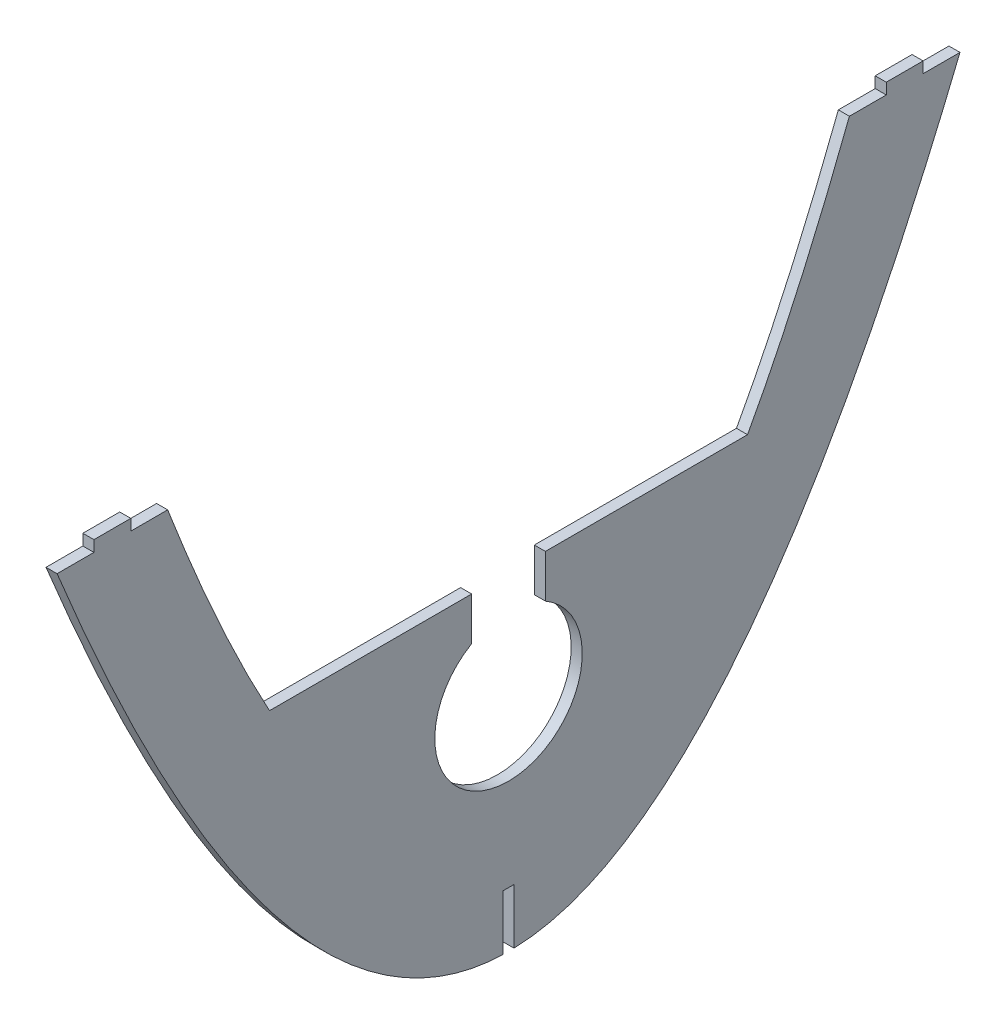
ISO-10303-21;
HEADER;
FILE_DESCRIPTION(('STEP AP214'),'2;1');
FILE_NAME('part.step','',(''),(''),'','','');
FILE_SCHEMA(('AUTOMOTIVE_DESIGN { 1 0 10303 214 1 1 1 1 }'));
ENDSEC;
DATA;
#1=APPLICATION_CONTEXT('core data for automotive mechanical design processes');
#2=APPLICATION_PROTOCOL_DEFINITION('international standard','automotive_design',2000,#1);
#3=PRODUCT_CONTEXT('',#1,'mechanical');
#4=PRODUCT('Part','Part','',(#3));
#5=PRODUCT_RELATED_PRODUCT_CATEGORY('part','',(#4));
#6=PRODUCT_DEFINITION_FORMATION('','',#4);
#7=PRODUCT_DEFINITION_CONTEXT('part definition',#1,'design');
#8=PRODUCT_DEFINITION('design','',#6,#7);
#9=PRODUCT_DEFINITION_SHAPE('','',#8);
#10=(LENGTH_UNIT() NAMED_UNIT(*) SI_UNIT(.MILLI.,.METRE.));
#11=(NAMED_UNIT(*) PLANE_ANGLE_UNIT() SI_UNIT($,.RADIAN.));
#12=(NAMED_UNIT(*) SI_UNIT($,.STERADIAN.) SOLID_ANGLE_UNIT());
#13=UNCERTAINTY_MEASURE_WITH_UNIT(LENGTH_MEASURE(1.E-05),#10,'distance_accuracy_value','');
#14=(GEOMETRIC_REPRESENTATION_CONTEXT(3) GLOBAL_UNCERTAINTY_ASSIGNED_CONTEXT((#13)) GLOBAL_UNIT_ASSIGNED_CONTEXT((#10,
#11,#12)) REPRESENTATION_CONTEXT('',''));
#15=CARTESIAN_POINT('',(0.,0.,0.));
#16=DIRECTION('',(0.,0.,1.));
#17=DIRECTION('',(1.,0.,0.));
#18=AXIS2_PLACEMENT_3D('',#15,#16,#17);
#19=CARTESIAN_POINT('',(3.,150.001256250819,122.475000000334));
#20=CARTESIAN_POINT('',(3.,-150.001256250735,3.44333936364016E-11));
#21=CARTESIAN_POINT('',(3.,150.001256250651,-122.475000000266));
#22=B_SPLINE_CURVE_WITH_KNOTS('',2,(#19,#20,#21),.UNSPECIFIED.,.F.,.F.,(3,3),
(0.0532838553968398,0.946716144602909),.UNSPECIFIED.);
#23=DIRECTION('',(-1.,0.,0.));
#24=VECTOR('',#23,1.);
#25=SURFACE_OF_LINEAR_EXTRUSION('',#22,#24);
#26=DIRECTION('',(-1.,0.,0.));
#27=VECTOR('',#26,1.);
#28=CARTESIAN_POINT('',(3.05,0.0225000000001966,1.50000000000711));
#29=LINE('',#28,#27);
#30=CARTESIAN_POINT('',(3.,0.0225000000001966,1.50000000000711));
#31=VERTEX_POINT('',#30);
#32=CARTESIAN_POINT('',(0.,0.0225000000001966,1.50000000000711));
#33=VERTEX_POINT('',#32);
#34=EDGE_CURVE('E216',#31,#33,#29,.T.);
#35=ORIENTED_EDGE('',*,*,#34,.F.);
#36=CARTESIAN_POINT('',(3.,150.001256250717,122.475000000293));
#37=VERTEX_POINT('',#36);
#38=EDGE_CURVE('E371',#37,#31,#22,.T.);
#39=ORIENTED_EDGE('',*,*,#38,.F.);
#40=DIRECTION('',(-1.,0.,0.));
#41=VECTOR('',#40,1.);
#42=CARTESIAN_POINT('',(3.,150.001256250717,122.475000000293));
#43=LINE('',#42,#41);
#44=CARTESIAN_POINT('',(0.,150.001256250717,122.475000000293));
#45=VERTEX_POINT('',#44);
#46=EDGE_CURVE('E47',#37,#45,#43,.T.);
#47=ORIENTED_EDGE('',*,*,#46,.T.);
#48=CARTESIAN_POINT('',(0.,150.001256250819,122.475000000334));
#49=CARTESIAN_POINT('',(0.,-150.001256250735,3.44333936364016E-11));
#50=CARTESIAN_POINT('',(0.,150.001256250651,-122.475000000266));
#51=B_SPLINE_CURVE_WITH_KNOTS('',2,(#48,#49,#50),.UNSPECIFIED.,.F.,.F.,(3,3),
(0.0532838553968398,0.946716144602909),.UNSPECIFIED.);
#52=EDGE_CURVE('E672',#45,#33,#51,.T.);
#53=ORIENTED_EDGE('',*,*,#52,.T.);
#54=EDGE_LOOP('',(#35,#39,#47,#53));
#55=FACE_BOUND('',#54,.T.);
#56=ADVANCED_FACE('F37',(#55),#25,.F.);
#57=CARTESIAN_POINT('',(3.,30.,5.20035403628327E-11));
#58=DIRECTION('',(-1.,0.,0.));
#59=DIRECTION('',(0.,0.,1.));
#60=AXIS2_PLACEMENT_3D('',#57,#58,#59);
#61=PLANE('',#60);
#62=DIRECTION('',(0.,-1.,0.));
#63=VECTOR('',#62,1.);
#64=CARTESIAN_POINT('',(3.,30.,1.5000000000071));
#65=LINE('',#64,#63);
#66=CARTESIAN_POINT('',(3.,15.0077934108547,1.5000000000071));
#67=VERTEX_POINT('',#66);
#68=EDGE_CURVE('E222',#67,#31,#65,.T.);
#69=ORIENTED_EDGE('',*,*,#68,.F.);
#70=DIRECTION('',(0.,0.,1.));
#71=VECTOR('',#70,1.);
#72=CARTESIAN_POINT('',(3.,15.0077934108547,5.20035403628327E-11));
#73=LINE('',#72,#71);
#74=CARTESIAN_POINT('',(3.,15.0077934108547,-1.4999999999929));
#75=VERTEX_POINT('',#74);
#76=EDGE_CURVE('E218',#75,#67,#73,.T.);
#77=ORIENTED_EDGE('',*,*,#76,.F.);
#78=DIRECTION('',(0.,-1.,0.));
#79=VECTOR('',#78,1.);
#80=CARTESIAN_POINT('',(3.,30.,-1.4999999999929));
#81=LINE('',#80,#79);
#82=CARTESIAN_POINT('',(3.,0.0224999999997687,-1.49999999999289));
#83=VERTEX_POINT('',#82);
#84=EDGE_CURVE('E197',#75,#83,#81,.T.);
#85=ORIENTED_EDGE('',*,*,#84,.T.);
#86=CARTESIAN_POINT('',(3.,150.001256250651,-122.475000000266));
#87=VERTEX_POINT('',#86);
#88=EDGE_CURVE('E370',#83,#87,#22,.T.);
#89=ORIENTED_EDGE('',*,*,#88,.T.);
#90=DIRECTION('',(0.,0.,1.));
#91=VECTOR('',#90,1.);
#92=CARTESIAN_POINT('',(3.,150.001256250717,-92.4754831027484));
#93=LINE('',#92,#91);
#94=CARTESIAN_POINT('',(3.,150.001256250717,-112.475241551507));
#95=VERTEX_POINT('',#94);
#96=EDGE_CURVE('E387',#87,#95,#93,.T.);
#97=ORIENTED_EDGE('',*,*,#96,.T.);
#98=DIRECTION('',(0.,-1.,0.));
#99=VECTOR('',#98,1.);
#100=CARTESIAN_POINT('',(3.,153.001256250717,-112.475241551507));
#101=LINE('',#100,#99);
#102=CARTESIAN_POINT('',(3.,153.001256250717,-112.475241551507));
#103=VERTEX_POINT('',#102);
#104=EDGE_CURVE('E277',#103,#95,#101,.T.);
#105=ORIENTED_EDGE('',*,*,#104,.F.);
#106=DIRECTION('',(0.,0.,-1.));
#107=VECTOR('',#106,1.);
#108=CARTESIAN_POINT('',(3.,153.001256250717,-4.2317463102242E-13));
#109=LINE('',#108,#107);
#110=CARTESIAN_POINT('',(3.,153.001256250717,-102.475241551507));
#111=VERTEX_POINT('',#110);
#112=EDGE_CURVE('E259',#111,#103,#109,.T.);
#113=ORIENTED_EDGE('',*,*,#112,.F.);
#114=DIRECTION('',(0.,-1.,0.));
#115=VECTOR('',#114,1.);
#116=CARTESIAN_POINT('',(3.,153.001256250717,-102.475241551507));
#117=LINE('',#116,#115);
#118=CARTESIAN_POINT('',(3.,150.001256250717,-102.475241551507));
#119=VERTEX_POINT('',#118);
#120=EDGE_CURVE('E280',#111,#119,#117,.T.);
#121=ORIENTED_EDGE('',*,*,#120,.T.);
#122=CARTESIAN_POINT('',(3.,150.001256250717,-92.4754831027484));
#123=VERTEX_POINT('',#122);
#124=EDGE_CURVE('E386',#119,#123,#93,.T.);
#125=ORIENTED_EDGE('',*,*,#124,.T.);
#126=CARTESIAN_POINT('',(3.,150.00125625071,-92.4754831027458));
#127=CARTESIAN_POINT('',(3.,-90.0012562508453,5.20035403628327E-11));
#128=CARTESIAN_POINT('',(3.,150.00125625098,92.4754831028499));
#129=B_SPLINE_CURVE_WITH_KNOTS('',2,(#126,#127,#128),.UNSPECIFIED.,.F.,.F.,(3,3),
(0.160021058447954,0.839978941551664),.UNSPECIFIED.);
#130=CARTESIAN_POINT('',(3.,88.9999999999905,-64.8424951685565));
#131=VERTEX_POINT('',#130);
#132=EDGE_CURVE('E324',#123,#131,#129,.T.);
#133=ORIENTED_EDGE('',*,*,#132,.T.);
#134=DIRECTION('',(0.,0.,1.));
#135=VECTOR('',#134,1.);
#136=CARTESIAN_POINT('',(3.,89.,-64.8424951686142));
#137=LINE('',#136,#135);
#138=CARTESIAN_POINT('',(3.,89.,-10.));
#139=VERTEX_POINT('',#138);
#140=EDGE_CURVE('E224',#131,#139,#137,.T.);
#141=ORIENTED_EDGE('',*,*,#140,.T.);
#142=DIRECTION('',(0.,-1.,0.));
#143=VECTOR('',#142,1.);
#144=CARTESIAN_POINT('',(3.,77.3205080756887,-10.0000000000002));
#145=LINE('',#144,#143);
#146=CARTESIAN_POINT('',(3.,77.3205080756887,-10.0000000000002));
#147=VERTEX_POINT('',#146);
#148=EDGE_CURVE('E236',#139,#147,#145,.T.);
#149=ORIENTED_EDGE('',*,*,#148,.T.);
#150=CARTESIAN_POINT('',(3.,60.,0.));
#151=DIRECTION('',(-1.,0.,0.));
#152=DIRECTION('',(0.,0.,-1.));
#153=AXIS2_PLACEMENT_3D('',#150,#151,#152);
#154=CIRCLE('',#153,20.);
#155=CARTESIAN_POINT('',(3.,77.3205080756887,10.0000000000002));
#156=VERTEX_POINT('',#155);
#157=EDGE_CURVE('E239',#147,#156,#154,.T.);
#158=ORIENTED_EDGE('',*,*,#157,.T.);
#159=DIRECTION('',(0.,1.,0.));
#160=VECTOR('',#159,1.);
#161=CARTESIAN_POINT('',(3.,77.3205080756887,10.0000000000002));
#162=LINE('',#161,#160);
#163=CARTESIAN_POINT('',(3.,89.,10.));
#164=VERTEX_POINT('',#163);
#165=EDGE_CURVE('E242',#156,#164,#162,.T.);
#166=ORIENTED_EDGE('',*,*,#165,.T.);
#167=DIRECTION('',(0.,0.,1.));
#168=VECTOR('',#167,1.);
#169=CARTESIAN_POINT('',(3.,89.,10.));
#170=LINE('',#169,#168);
#171=CARTESIAN_POINT('',(3.,88.9999999999904,64.8424951685564));
#172=VERTEX_POINT('',#171);
#173=EDGE_CURVE('E245',#164,#172,#170,.T.);
#174=ORIENTED_EDGE('',*,*,#173,.T.);
#175=CARTESIAN_POINT('',(3.,150.001256250717,92.4754831027483));
#176=VERTEX_POINT('',#175);
#177=EDGE_CURVE('E63',#172,#176,#129,.T.);
#178=ORIENTED_EDGE('',*,*,#177,.T.);
#179=DIRECTION('',(0.,0.,1.));
#180=VECTOR('',#179,1.);
#181=CARTESIAN_POINT('',(3.,150.001256250717,122.475000000293));
#182=LINE('',#181,#180);
#183=CARTESIAN_POINT('',(3.,150.001256250717,102.47524155152));
#184=VERTEX_POINT('',#183);
#185=EDGE_CURVE('E315',#176,#184,#182,.T.);
#186=ORIENTED_EDGE('',*,*,#185,.T.);
#187=DIRECTION('',(0.,-1.,0.));
#188=VECTOR('',#187,1.);
#189=CARTESIAN_POINT('',(3.,153.001256250717,102.47524155152));
#190=LINE('',#189,#188);
#191=CARTESIAN_POINT('',(3.,153.001256250717,102.47524155152));
#192=VERTEX_POINT('',#191);
#193=EDGE_CURVE('E305',#192,#184,#190,.T.);
#194=ORIENTED_EDGE('',*,*,#193,.F.);
#195=DIRECTION('',(0.,0.,-1.));
#196=VECTOR('',#195,1.);
#197=CARTESIAN_POINT('',(3.,153.001256250717,-4.2317463102242E-13));
#198=LINE('',#197,#196);
#199=CARTESIAN_POINT('',(3.,153.001256250717,112.47524155152));
#200=VERTEX_POINT('',#199);
#201=EDGE_CURVE('E287',#200,#192,#198,.T.);
#202=ORIENTED_EDGE('',*,*,#201,.F.);
#203=DIRECTION('',(0.,-1.,0.));
#204=VECTOR('',#203,1.);
#205=CARTESIAN_POINT('',(3.,153.001256250717,112.47524155152));
#206=LINE('',#205,#204);
#207=CARTESIAN_POINT('',(3.,150.001256250717,112.47524155152));
#208=VERTEX_POINT('',#207);
#209=EDGE_CURVE('E308',#200,#208,#206,.T.);
#210=ORIENTED_EDGE('',*,*,#209,.T.);
#211=EDGE_CURVE('E327',#208,#37,#182,.T.);
#212=ORIENTED_EDGE('',*,*,#211,.T.);
#213=ORIENTED_EDGE('',*,*,#38,.T.);
#214=EDGE_LOOP('',(#69,#77,#85,#89,#97,#105,#113,#121,#125,#133,#141,#149,#158,#166,#174,#178,
#186,#194,#202,#210,#212,#213));
#215=FACE_BOUND('',#214,.T.);
#216=ADVANCED_FACE('F353',(#215),#61,.F.);
#217=CARTESIAN_POINT('',(0.,30.,5.20035403628327E-11));
#218=DIRECTION('',(-1.,0.,0.));
#219=DIRECTION('',(0.,0.,1.));
#220=AXIS2_PLACEMENT_3D('',#217,#218,#219);
#221=PLANE('',#220);
#222=DIRECTION('',(0.,0.,1.));
#223=VECTOR('',#222,1.);
#224=CARTESIAN_POINT('',(0.,15.0077934108547,0.));
#225=LINE('',#224,#223);
#226=CARTESIAN_POINT('',(0.,15.0077934108547,-1.4999999999929));
#227=VERTEX_POINT('',#226);
#228=CARTESIAN_POINT('',(0.,15.0077934108547,1.5000000000071));
#229=VERTEX_POINT('',#228);
#230=EDGE_CURVE('E204',#227,#229,#225,.T.);
#231=ORIENTED_EDGE('',*,*,#230,.T.);
#232=DIRECTION('',(0.,-1.,0.));
#233=VECTOR('',#232,1.);
#234=CARTESIAN_POINT('',(0.,0.,1.5000000000071));
#235=LINE('',#234,#233);
#236=EDGE_CURVE('E55',#229,#33,#235,.T.);
#237=ORIENTED_EDGE('',*,*,#236,.T.);
#238=ORIENTED_EDGE('',*,*,#52,.F.);
#239=DIRECTION('',(0.,0.,1.));
#240=VECTOR('',#239,1.);
#241=CARTESIAN_POINT('',(0.,150.001256250717,122.475000000293));
#242=LINE('',#241,#240);
#243=CARTESIAN_POINT('',(0.,150.001256250717,112.47524155152));
#244=VERTEX_POINT('',#243);
#245=EDGE_CURVE('E366',#244,#45,#242,.T.);
#246=ORIENTED_EDGE('',*,*,#245,.F.);
#247=DIRECTION('',(0.,-1.,0.));
#248=VECTOR('',#247,1.);
#249=CARTESIAN_POINT('',(0.,153.001256250717,112.47524155152));
#250=LINE('',#249,#248);
#251=CARTESIAN_POINT('',(0.,153.001256250717,112.47524155152));
#252=VERTEX_POINT('',#251);
#253=EDGE_CURVE('E296',#252,#244,#250,.T.);
#254=ORIENTED_EDGE('',*,*,#253,.F.);
#255=DIRECTION('',(0.,0.,-1.));
#256=VECTOR('',#255,1.);
#257=CARTESIAN_POINT('',(0.,153.001256250717,-4.2317463102242E-13));
#258=LINE('',#257,#256);
#259=CARTESIAN_POINT('',(0.,153.001256250717,102.47524155152));
#260=VERTEX_POINT('',#259);
#261=EDGE_CURVE('E293',#252,#260,#258,.T.);
#262=ORIENTED_EDGE('',*,*,#261,.T.);
#263=DIRECTION('',(0.,-1.,0.));
#264=VECTOR('',#263,1.);
#265=CARTESIAN_POINT('',(0.,153.001256250717,102.47524155152));
#266=LINE('',#265,#264);
#267=CARTESIAN_POINT('',(0.,150.001256250717,102.47524155152));
#268=VERTEX_POINT('',#267);
#269=EDGE_CURVE('E302',#260,#268,#266,.T.);
#270=ORIENTED_EDGE('',*,*,#269,.T.);
#271=CARTESIAN_POINT('',(0.,150.001256250717,92.4754831027483));
#272=VERTEX_POINT('',#271);
#273=EDGE_CURVE('E363',#272,#268,#242,.T.);
#274=ORIENTED_EDGE('',*,*,#273,.F.);
#275=CARTESIAN_POINT('',(0.,150.00125625071,-92.4754831027458));
#276=CARTESIAN_POINT('',(0.,-90.0012562508453,5.20035403628327E-11));
#277=CARTESIAN_POINT('',(0.,150.00125625098,92.4754831028499));
#278=B_SPLINE_CURVE_WITH_KNOTS('',2,(#275,#276,#277),.UNSPECIFIED.,.F.,.F.,(3,3),
(0.160021058447954,0.839978941551664),.UNSPECIFIED.);
#279=CARTESIAN_POINT('',(0.,89.,64.8424951686142));
#280=VERTEX_POINT('',#279);
#281=EDGE_CURVE('E310',#280,#272,#278,.T.);
#282=ORIENTED_EDGE('',*,*,#281,.F.);
#283=DIRECTION('',(0.,0.,1.));
#284=VECTOR('',#283,1.);
#285=CARTESIAN_POINT('',(0.,89.,10.));
#286=LINE('',#285,#284);
#287=CARTESIAN_POINT('',(0.,89.,10.));
#288=VERTEX_POINT('',#287);
#289=EDGE_CURVE('E235',#288,#280,#286,.T.);
#290=ORIENTED_EDGE('',*,*,#289,.F.);
#291=DIRECTION('',(0.,1.,0.));
#292=VECTOR('',#291,1.);
#293=CARTESIAN_POINT('',(0.,77.3205080756887,10.0000000000002));
#294=LINE('',#293,#292);
#295=CARTESIAN_POINT('',(0.,77.3205080756887,10.0000000000002));
#296=VERTEX_POINT('',#295);
#297=EDGE_CURVE('E232',#296,#288,#294,.T.);
#298=ORIENTED_EDGE('',*,*,#297,.F.);
#299=CARTESIAN_POINT('',(0.,60.,0.));
#300=DIRECTION('',(-1.,0.,0.));
#301=DIRECTION('',(0.,0.,-1.));
#302=AXIS2_PLACEMENT_3D('',#299,#300,#301);
#303=CIRCLE('',#302,20.);
#304=CARTESIAN_POINT('',(0.,77.3205080756887,-10.0000000000002));
#305=VERTEX_POINT('',#304);
#306=EDGE_CURVE('E228',#305,#296,#303,.T.);
#307=ORIENTED_EDGE('',*,*,#306,.F.);
#308=DIRECTION('',(0.,-1.,0.));
#309=VECTOR('',#308,1.);
#310=CARTESIAN_POINT('',(0.,77.3205080756887,-10.0000000000002));
#311=LINE('',#310,#309);
#312=CARTESIAN_POINT('',(0.,89.,-10.));
#313=VERTEX_POINT('',#312);
#314=EDGE_CURVE('E225',#313,#305,#311,.T.);
#315=ORIENTED_EDGE('',*,*,#314,.F.);
#316=DIRECTION('',(0.,0.,1.));
#317=VECTOR('',#316,1.);
#318=CARTESIAN_POINT('',(0.,89.,-64.8424951686142));
#319=LINE('',#318,#317);
#320=CARTESIAN_POINT('',(0.,88.9999999999905,-64.8424951685565));
#321=VERTEX_POINT('',#320);
#322=EDGE_CURVE('E229',#321,#313,#319,.T.);
#323=ORIENTED_EDGE('',*,*,#322,.F.);
#324=CARTESIAN_POINT('',(0.,150.001256250717,-92.4754831027484));
#325=VERTEX_POINT('',#324);
#326=EDGE_CURVE('E362',#325,#321,#278,.T.);
#327=ORIENTED_EDGE('',*,*,#326,.F.);
#328=DIRECTION('',(0.,0.,1.));
#329=VECTOR('',#328,1.);
#330=CARTESIAN_POINT('',(0.,150.001256250717,-92.4754831027484));
#331=LINE('',#330,#329);
#332=CARTESIAN_POINT('',(0.,150.001256250717,-102.475241551507));
#333=VERTEX_POINT('',#332);
#334=EDGE_CURVE('E651',#333,#325,#331,.T.);
#335=ORIENTED_EDGE('',*,*,#334,.F.);
#336=DIRECTION('',(0.,-1.,0.));
#337=VECTOR('',#336,1.);
#338=CARTESIAN_POINT('',(0.,153.001256250717,-102.475241551507));
#339=LINE('',#338,#337);
#340=CARTESIAN_POINT('',(0.,153.001256250717,-102.475241551507));
#341=VERTEX_POINT('',#340);
#342=EDGE_CURVE('E266',#341,#333,#339,.T.);
#343=ORIENTED_EDGE('',*,*,#342,.F.);
#344=DIRECTION('',(0.,0.,1.));
#345=VECTOR('',#344,1.);
#346=CARTESIAN_POINT('',(0.,153.001256250717,-4.2317463102242E-13));
#347=LINE('',#346,#345);
#348=CARTESIAN_POINT('',(0.,153.001256250717,-112.475241551507));
#349=VERTEX_POINT('',#348);
#350=EDGE_CURVE('E264',#349,#341,#347,.T.);
#351=ORIENTED_EDGE('',*,*,#350,.F.);
#352=DIRECTION('',(0.,-1.,0.));
#353=VECTOR('',#352,1.);
#354=CARTESIAN_POINT('',(0.,153.001256250717,-112.475241551507));
#355=LINE('',#354,#353);
#356=CARTESIAN_POINT('',(0.,150.001256250717,-112.475241551507));
#357=VERTEX_POINT('',#356);
#358=EDGE_CURVE('E274',#349,#357,#355,.T.);
#359=ORIENTED_EDGE('',*,*,#358,.T.);
#360=CARTESIAN_POINT('',(0.,150.001256250651,-122.475000000266));
#361=VERTEX_POINT('',#360);
#362=EDGE_CURVE('E331',#361,#357,#331,.T.);
#363=ORIENTED_EDGE('',*,*,#362,.F.);
#364=CARTESIAN_POINT('',(0.,0.0224999999997687,-1.49999999999289));
#365=VERTEX_POINT('',#364);
#366=EDGE_CURVE('E211',#365,#361,#51,.T.);
#367=ORIENTED_EDGE('',*,*,#366,.F.);
#368=DIRECTION('',(0.,-1.,0.));
#369=VECTOR('',#368,1.);
#370=CARTESIAN_POINT('',(0.,0.,-1.4999999999929));
#371=LINE('',#370,#369);
#372=EDGE_CURVE('E194',#227,#365,#371,.T.);
#373=ORIENTED_EDGE('',*,*,#372,.F.);
#374=EDGE_LOOP('',(#231,#237,#238,#246,#254,#262,#270,#274,#282,#290,#298,#307,#315,#323,#327,
#335,#343,#351,#359,#363,#367,#373));
#375=FACE_BOUND('',#374,.T.);
#376=ADVANCED_FACE('F209',(#375),#221,.T.);
#377=DIRECTION('',(-1.,0.,0.));
#378=VECTOR('',#377,1.);
#379=SURFACE_OF_LINEAR_EXTRUSION('',#129,#378);
#380=ORIENTED_EDGE('',*,*,#177,.F.);
#381=DIRECTION('',(1.,0.,0.));
#382=VECTOR('',#381,1.);
#383=CARTESIAN_POINT('',(0.,89.,64.8424951686142));
#384=LINE('',#383,#382);
#385=EDGE_CURVE('E248',#280,#172,#384,.T.);
#386=ORIENTED_EDGE('',*,*,#385,.F.);
#387=ORIENTED_EDGE('',*,*,#281,.T.);
#388=DIRECTION('',(-1.,0.,0.));
#389=VECTOR('',#388,1.);
#390=CARTESIAN_POINT('',(3.,150.001256250717,92.4754831027483));
#391=LINE('',#390,#389);
#392=EDGE_CURVE('E11',#176,#272,#391,.T.);
#393=ORIENTED_EDGE('',*,*,#392,.F.);
#394=EDGE_LOOP('',(#380,#386,#387,#393));
#395=FACE_BOUND('',#394,.T.);
#396=ADVANCED_FACE('F360',(#395),#379,.F.);
#397=CARTESIAN_POINT('',(3.,150.001256250717,-92.4754831027484));
#398=DIRECTION('',(0.,-1.,0.));
#399=DIRECTION('',(0.,0.,-1.));
#400=AXIS2_PLACEMENT_3D('',#397,#398,#399);
#401=PLANE('',#400);
#402=DIRECTION('',(-1.,0.,0.));
#403=VECTOR('',#402,1.);
#404=CARTESIAN_POINT('',(0.,150.001256250717,-112.475241551507));
#405=LINE('',#404,#403);
#406=EDGE_CURVE('E260',#95,#357,#405,.T.);
#407=ORIENTED_EDGE('',*,*,#406,.F.);
#408=ORIENTED_EDGE('',*,*,#96,.F.);
#409=DIRECTION('',(-1.,0.,0.));
#410=VECTOR('',#409,1.);
#411=CARTESIAN_POINT('',(3.,150.001256250651,-122.475000000266));
#412=LINE('',#411,#410);
#413=EDGE_CURVE('E383',#87,#361,#412,.T.);
#414=ORIENTED_EDGE('',*,*,#413,.T.);
#415=ORIENTED_EDGE('',*,*,#362,.T.);
#416=EDGE_LOOP('',(#407,#408,#414,#415));
#417=FACE_BOUND('',#416,.T.);
#418=ADVANCED_FACE('F410',(#417),#401,.F.);
#419=CARTESIAN_POINT('',(3.,150.001256250717,122.475000000293));
#420=DIRECTION('',(0.,-1.,0.));
#421=DIRECTION('',(0.,0.,-1.));
#422=AXIS2_PLACEMENT_3D('',#419,#420,#421);
#423=PLANE('',#422);
#424=DIRECTION('',(1.,0.,0.));
#425=VECTOR('',#424,1.);
#426=CARTESIAN_POINT('',(0.,150.001256250717,112.47524155152));
#427=LINE('',#426,#425);
#428=EDGE_CURVE('E283',#244,#208,#427,.T.);
#429=ORIENTED_EDGE('',*,*,#428,.F.);
#430=ORIENTED_EDGE('',*,*,#245,.T.);
#431=ORIENTED_EDGE('',*,*,#46,.F.);
#432=ORIENTED_EDGE('',*,*,#211,.F.);
#433=EDGE_LOOP('',(#429,#430,#431,#432));
#434=FACE_BOUND('',#433,.T.);
#435=ADVANCED_FACE('F379',(#434),#423,.F.);
#436=ORIENTED_EDGE('',*,*,#326,.T.);
#437=DIRECTION('',(1.,0.,0.));
#438=VECTOR('',#437,1.);
#439=CARTESIAN_POINT('',(0.,89.,-64.8424951686142));
#440=LINE('',#439,#438);
#441=EDGE_CURVE('E255',#321,#131,#440,.T.);
#442=ORIENTED_EDGE('',*,*,#441,.T.);
#443=ORIENTED_EDGE('',*,*,#132,.F.);
#444=DIRECTION('',(-1.,0.,0.));
#445=VECTOR('',#444,1.);
#446=CARTESIAN_POINT('',(3.,150.001256250717,-92.4754831027484));
#447=LINE('',#446,#445);
#448=EDGE_CURVE('E645',#123,#325,#447,.T.);
#449=ORIENTED_EDGE('',*,*,#448,.T.);
#450=EDGE_LOOP('',(#436,#442,#443,#449));
#451=FACE_BOUND('',#450,.T.);
#452=ADVANCED_FACE('F39',(#451),#379,.F.);
#453=ORIENTED_EDGE('',*,*,#273,.T.);
#454=DIRECTION('',(1.,0.,0.));
#455=VECTOR('',#454,1.);
#456=CARTESIAN_POINT('',(0.,150.001256250717,102.47524155152));
#457=LINE('',#456,#455);
#458=EDGE_CURVE('E288',#268,#184,#457,.T.);
#459=ORIENTED_EDGE('',*,*,#458,.T.);
#460=ORIENTED_EDGE('',*,*,#185,.F.);
#461=ORIENTED_EDGE('',*,*,#392,.T.);
#462=EDGE_LOOP('',(#453,#459,#460,#461));
#463=FACE_BOUND('',#462,.T.);
#464=ADVANCED_FACE('F368',(#463),#423,.F.);
#465=ORIENTED_EDGE('',*,*,#88,.F.);
#466=DIRECTION('',(-1.,0.,0.));
#467=VECTOR('',#466,1.);
#468=CARTESIAN_POINT('',(3.05,0.0224999999997687,-1.49999999999289));
#469=LINE('',#468,#467);
#470=EDGE_CURVE('E200',#83,#365,#469,.T.);
#471=ORIENTED_EDGE('',*,*,#470,.T.);
#472=ORIENTED_EDGE('',*,*,#366,.T.);
#473=ORIENTED_EDGE('',*,*,#413,.F.);
#474=EDGE_LOOP('',(#465,#471,#472,#473));
#475=FACE_BOUND('',#474,.T.);
#476=ADVANCED_FACE('F396',(#475),#25,.F.);
#477=ORIENTED_EDGE('',*,*,#124,.F.);
#478=DIRECTION('',(-1.,0.,0.));
#479=VECTOR('',#478,1.);
#480=CARTESIAN_POINT('',(0.,150.001256250717,-102.475241551507));
#481=LINE('',#480,#479);
#482=EDGE_CURVE('E267',#119,#333,#481,.T.);
#483=ORIENTED_EDGE('',*,*,#482,.T.);
#484=ORIENTED_EDGE('',*,*,#334,.T.);
#485=ORIENTED_EDGE('',*,*,#448,.F.);
#486=EDGE_LOOP('',(#477,#483,#484,#485));
#487=FACE_BOUND('',#486,.T.);
#488=ADVANCED_FACE('F399',(#487),#401,.F.);
#489=CARTESIAN_POINT('',(0.,153.001256250717,112.47524155152));
#490=DIRECTION('',(0.,0.,-1.));
#491=DIRECTION('',(0.,1.,0.));
#492=AXIS2_PLACEMENT_3D('',#489,#490,#491);
#493=PLANE('',#492);
#494=ORIENTED_EDGE('',*,*,#428,.T.);
#495=ORIENTED_EDGE('',*,*,#209,.F.);
#496=DIRECTION('',(1.,0.,0.));
#497=VECTOR('',#496,1.);
#498=CARTESIAN_POINT('',(0.,153.001256250717,112.47524155152));
#499=LINE('',#498,#497);
#500=EDGE_CURVE('E284',#252,#200,#499,.T.);
#501=ORIENTED_EDGE('',*,*,#500,.F.);
#502=ORIENTED_EDGE('',*,*,#253,.T.);
#503=EDGE_LOOP('',(#494,#495,#501,#502));
#504=FACE_BOUND('',#503,.T.);
#505=ADVANCED_FACE('F421',(#504),#493,.F.);
#506=CARTESIAN_POINT('',(0.,153.001256250717,102.47524155152));
#507=DIRECTION('',(0.,0.,-1.));
#508=DIRECTION('',(0.,1.,0.));
#509=AXIS2_PLACEMENT_3D('',#506,#507,#508);
#510=PLANE('',#509);
#511=ORIENTED_EDGE('',*,*,#458,.F.);
#512=ORIENTED_EDGE('',*,*,#269,.F.);
#513=DIRECTION('',(1.,0.,0.));
#514=VECTOR('',#513,1.);
#515=CARTESIAN_POINT('',(0.,153.001256250717,102.47524155152));
#516=LINE('',#515,#514);
#517=EDGE_CURVE('E290',#260,#192,#516,.T.);
#518=ORIENTED_EDGE('',*,*,#517,.T.);
#519=ORIENTED_EDGE('',*,*,#193,.T.);
#520=EDGE_LOOP('',(#511,#512,#518,#519));
#521=FACE_BOUND('',#520,.T.);
#522=ADVANCED_FACE('F424',(#521),#510,.T.);
#523=CARTESIAN_POINT('',(0.,153.001256250717,-4.2317463102242E-13));
#524=DIRECTION('',(0.,1.,0.));
#525=DIRECTION('',(0.,0.,1.));
#526=AXIS2_PLACEMENT_3D('',#523,#524,#525);
#527=PLANE('',#526);
#528=ORIENTED_EDGE('',*,*,#500,.T.);
#529=ORIENTED_EDGE('',*,*,#201,.T.);
#530=ORIENTED_EDGE('',*,*,#517,.F.);
#531=ORIENTED_EDGE('',*,*,#261,.F.);
#532=EDGE_LOOP('',(#528,#529,#530,#531));
#533=FACE_BOUND('',#532,.T.);
#534=ADVANCED_FACE('F428',(#533),#527,.T.);
#535=CARTESIAN_POINT('',(0.,153.001256250717,-102.475241551507));
#536=DIRECTION('',(0.,0.,1.));
#537=DIRECTION('',(0.,-1.,0.));
#538=AXIS2_PLACEMENT_3D('',#535,#536,#537);
#539=PLANE('',#538);
#540=ORIENTED_EDGE('',*,*,#482,.F.);
#541=ORIENTED_EDGE('',*,*,#120,.F.);
#542=DIRECTION('',(-1.,0.,0.));
#543=VECTOR('',#542,1.);
#544=CARTESIAN_POINT('',(0.,153.001256250717,-102.475241551507));
#545=LINE('',#544,#543);
#546=EDGE_CURVE('E256',#111,#341,#545,.T.);
#547=ORIENTED_EDGE('',*,*,#546,.T.);
#548=ORIENTED_EDGE('',*,*,#342,.T.);
#549=EDGE_LOOP('',(#540,#541,#547,#548));
#550=FACE_BOUND('',#549,.T.);
#551=ADVANCED_FACE('F432',(#550),#539,.T.);
#552=CARTESIAN_POINT('',(0.,153.001256250717,-112.475241551507));
#553=DIRECTION('',(0.,0.,1.));
#554=DIRECTION('',(0.,-1.,0.));
#555=AXIS2_PLACEMENT_3D('',#552,#553,#554);
#556=PLANE('',#555);
#557=ORIENTED_EDGE('',*,*,#406,.T.);
#558=ORIENTED_EDGE('',*,*,#358,.F.);
#559=DIRECTION('',(-1.,0.,0.));
#560=VECTOR('',#559,1.);
#561=CARTESIAN_POINT('',(0.,153.001256250717,-112.475241551507));
#562=LINE('',#561,#560);
#563=EDGE_CURVE('E262',#103,#349,#562,.T.);
#564=ORIENTED_EDGE('',*,*,#563,.F.);
#565=ORIENTED_EDGE('',*,*,#104,.T.);
#566=EDGE_LOOP('',(#557,#558,#564,#565));
#567=FACE_BOUND('',#566,.T.);
#568=ADVANCED_FACE('F436',(#567),#556,.F.);
#569=CARTESIAN_POINT('',(0.,153.001256250717,-4.2317463102242E-13));
#570=DIRECTION('',(0.,1.,0.));
#571=DIRECTION('',(0.,0.,1.));
#572=AXIS2_PLACEMENT_3D('',#569,#570,#571);
#573=PLANE('',#572);
#574=ORIENTED_EDGE('',*,*,#546,.F.);
#575=ORIENTED_EDGE('',*,*,#112,.T.);
#576=ORIENTED_EDGE('',*,*,#563,.T.);
#577=ORIENTED_EDGE('',*,*,#350,.T.);
#578=EDGE_LOOP('',(#574,#575,#576,#577));
#579=FACE_BOUND('',#578,.T.);
#580=ADVANCED_FACE('F440',(#579),#573,.T.);
#581=CARTESIAN_POINT('',(0.,89.,10.));
#582=DIRECTION('',(0.,1.,0.));
#583=DIRECTION('',(0.,0.,1.));
#584=AXIS2_PLACEMENT_3D('',#581,#582,#583);
#585=PLANE('',#584);
#586=ORIENTED_EDGE('',*,*,#173,.F.);
#587=DIRECTION('',(1.,0.,0.));
#588=VECTOR('',#587,1.);
#589=CARTESIAN_POINT('',(0.,89.,10.));
#590=LINE('',#589,#588);
#591=EDGE_CURVE('E246',#288,#164,#590,.T.);
#592=ORIENTED_EDGE('',*,*,#591,.F.);
#593=ORIENTED_EDGE('',*,*,#289,.T.);
#594=ORIENTED_EDGE('',*,*,#385,.T.);
#595=EDGE_LOOP('',(#586,#592,#593,#594));
#596=FACE_BOUND('',#595,.T.);
#597=ADVANCED_FACE('F358',(#596),#585,.T.);
#598=CARTESIAN_POINT('',(0.,77.3205080756887,10.0000000000002));
#599=DIRECTION('',(0.,0.,-1.));
#600=DIRECTION('',(0.,1.,0.));
#601=AXIS2_PLACEMENT_3D('',#598,#599,#600);
#602=PLANE('',#601);
#603=ORIENTED_EDGE('',*,*,#165,.F.);
#604=DIRECTION('',(1.,0.,0.));
#605=VECTOR('',#604,1.);
#606=CARTESIAN_POINT('',(0.,77.3205080756887,10.0000000000002));
#607=LINE('',#606,#605);
#608=EDGE_CURVE('E249',#296,#156,#607,.T.);
#609=ORIENTED_EDGE('',*,*,#608,.F.);
#610=ORIENTED_EDGE('',*,*,#297,.T.);
#611=ORIENTED_EDGE('',*,*,#591,.T.);
#612=EDGE_LOOP('',(#603,#609,#610,#611));
#613=FACE_BOUND('',#612,.T.);
#614=ADVANCED_FACE('F457',(#613),#602,.T.);
#615=CARTESIAN_POINT('',(0.,60.,0.));
#616=DIRECTION('',(1.,0.,0.));
#617=DIRECTION('',(0.,0.,-1.));
#618=AXIS2_PLACEMENT_3D('',#615,#616,#617);
#619=CYLINDRICAL_SURFACE('',#618,20.);
#620=ORIENTED_EDGE('',*,*,#157,.F.);
#621=DIRECTION('',(1.,0.,0.));
#622=VECTOR('',#621,1.);
#623=CARTESIAN_POINT('',(0.,77.3205080756887,-10.0000000000002));
#624=LINE('',#623,#622);
#625=EDGE_CURVE('E251',#305,#147,#624,.T.);
#626=ORIENTED_EDGE('',*,*,#625,.F.);
#627=ORIENTED_EDGE('',*,*,#306,.T.);
#628=ORIENTED_EDGE('',*,*,#608,.T.);
#629=EDGE_LOOP('',(#620,#626,#627,#628));
#630=FACE_BOUND('',#629,.T.);
#631=ADVANCED_FACE('F453',(#630),#619,.F.);
#632=CARTESIAN_POINT('',(0.,77.3205080756887,-10.0000000000002));
#633=DIRECTION('',(0.,0.,1.));
#634=DIRECTION('',(0.,-1.,0.));
#635=AXIS2_PLACEMENT_3D('',#632,#633,#634);
#636=PLANE('',#635);
#637=ORIENTED_EDGE('',*,*,#148,.F.);
#638=DIRECTION('',(1.,0.,0.));
#639=VECTOR('',#638,1.);
#640=CARTESIAN_POINT('',(0.,89.,-10.));
#641=LINE('',#640,#639);
#642=EDGE_CURVE('E253',#313,#139,#641,.T.);
#643=ORIENTED_EDGE('',*,*,#642,.F.);
#644=ORIENTED_EDGE('',*,*,#314,.T.);
#645=ORIENTED_EDGE('',*,*,#625,.T.);
#646=EDGE_LOOP('',(#637,#643,#644,#645));
#647=FACE_BOUND('',#646,.T.);
#648=ADVANCED_FACE('F449',(#647),#636,.T.);
#649=CARTESIAN_POINT('',(0.,89.,-64.8424951686142));
#650=DIRECTION('',(0.,1.,0.));
#651=DIRECTION('',(0.,0.,1.));
#652=AXIS2_PLACEMENT_3D('',#649,#650,#651);
#653=PLANE('',#652);
#654=ORIENTED_EDGE('',*,*,#140,.F.);
#655=ORIENTED_EDGE('',*,*,#441,.F.);
#656=ORIENTED_EDGE('',*,*,#322,.T.);
#657=ORIENTED_EDGE('',*,*,#642,.T.);
#658=EDGE_LOOP('',(#654,#655,#656,#657));
#659=FACE_BOUND('',#658,.T.);
#660=ADVANCED_FACE('F445',(#659),#653,.T.);
#661=CARTESIAN_POINT('',(3.05,0.,1.5000000000071));
#662=DIRECTION('',(0.,0.,-1.));
#663=DIRECTION('',(-1.,0.,0.));
#664=AXIS2_PLACEMENT_3D('',#661,#662,#663);
#665=PLANE('',#664);
#666=ORIENTED_EDGE('',*,*,#68,.T.);
#667=ORIENTED_EDGE('',*,*,#34,.T.);
#668=ORIENTED_EDGE('',*,*,#236,.F.);
#669=DIRECTION('',(-1.,0.,0.));
#670=VECTOR('',#669,1.);
#671=CARTESIAN_POINT('',(3.05,15.0077934108547,1.5000000000071));
#672=LINE('',#671,#670);
#673=EDGE_CURVE('E201',#67,#229,#672,.T.);
#674=ORIENTED_EDGE('',*,*,#673,.F.);
#675=EDGE_LOOP('',(#666,#667,#668,#674));
#676=FACE_BOUND('',#675,.T.);
#677=ADVANCED_FACE('F448',(#676),#665,.T.);
#678=CARTESIAN_POINT('',(3.05,0.,-1.4999999999929));
#679=DIRECTION('',(0.,0.,-1.));
#680=DIRECTION('',(-1.,0.,0.));
#681=AXIS2_PLACEMENT_3D('',#678,#679,#680);
#682=PLANE('',#681);
#683=DIRECTION('',(-1.,0.,0.));
#684=VECTOR('',#683,1.);
#685=CARTESIAN_POINT('',(3.05,15.0077934108547,-1.4999999999929));
#686=LINE('',#685,#684);
#687=EDGE_CURVE('E190',#75,#227,#686,.T.);
#688=ORIENTED_EDGE('',*,*,#687,.T.);
#689=ORIENTED_EDGE('',*,*,#372,.T.);
#690=ORIENTED_EDGE('',*,*,#470,.F.);
#691=ORIENTED_EDGE('',*,*,#84,.F.);
#692=EDGE_LOOP('',(#688,#689,#690,#691));
#693=FACE_BOUND('',#692,.T.);
#694=ADVANCED_FACE('F192',(#693),#682,.F.);
#695=CARTESIAN_POINT('',(3.05,15.0077934108547,0.));
#696=DIRECTION('',(0.,-1.,0.));
#697=DIRECTION('',(0.,0.,-1.));
#698=AXIS2_PLACEMENT_3D('',#695,#696,#697);
#699=PLANE('',#698);
#700=ORIENTED_EDGE('',*,*,#76,.T.);
#701=ORIENTED_EDGE('',*,*,#673,.T.);
#702=ORIENTED_EDGE('',*,*,#230,.F.);
#703=ORIENTED_EDGE('',*,*,#687,.F.);
#704=EDGE_LOOP('',(#700,#701,#702,#703));
#705=FACE_BOUND('',#704,.T.);
#706=ADVANCED_FACE('F205',(#705),#699,.T.);
#707=CLOSED_SHELL('',(#56,#216,#376,#396,#418,#435,#452,#464,#476,#488,#505,#522,#534,#551,#568,
#580,#597,#614,#631,#648,#660,#677,#694,#706));
#708=MANIFOLD_SOLID_BREP('B2',#707);
#709=ADVANCED_BREP_SHAPE_REPRESENTATION('',(#18,#708),#14);
#710=SHAPE_DEFINITION_REPRESENTATION(#9,#709);
ENDSEC;
END-ISO-10303-21;
